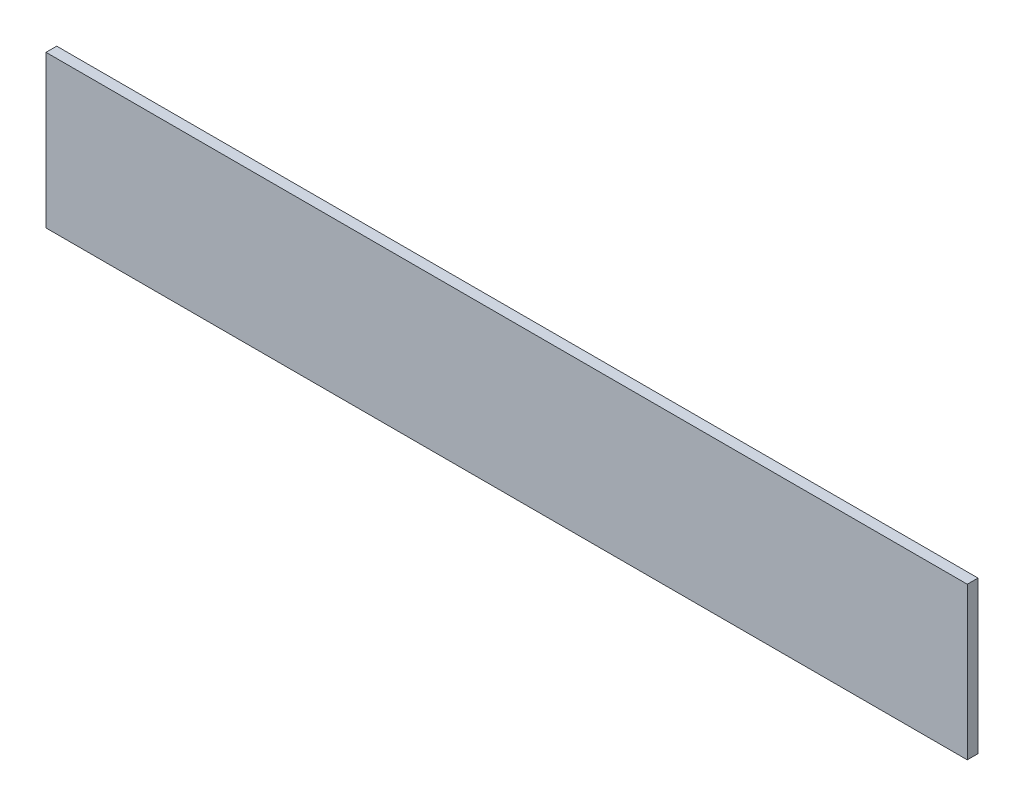
ISO-10303-21;
HEADER;
FILE_DESCRIPTION(('STEP AP214'),'2;1');
FILE_NAME('part.step','',(''),(''),'','','');
FILE_SCHEMA(('AUTOMOTIVE_DESIGN { 1 0 10303 214 1 1 1 1 }'));
ENDSEC;
DATA;
#1=APPLICATION_CONTEXT('core data for automotive mechanical design processes');
#2=APPLICATION_PROTOCOL_DEFINITION('international standard','automotive_design',2000,#1);
#3=PRODUCT_CONTEXT('',#1,'mechanical');
#4=PRODUCT('Part','Part','',(#3));
#5=PRODUCT_RELATED_PRODUCT_CATEGORY('part','',(#4));
#6=PRODUCT_DEFINITION_FORMATION('','',#4);
#7=PRODUCT_DEFINITION_CONTEXT('part definition',#1,'design');
#8=PRODUCT_DEFINITION('design','',#6,#7);
#9=PRODUCT_DEFINITION_SHAPE('','',#8);
#10=(LENGTH_UNIT() NAMED_UNIT(*) SI_UNIT(.MILLI.,.METRE.));
#11=(NAMED_UNIT(*) PLANE_ANGLE_UNIT() SI_UNIT($,.RADIAN.));
#12=(NAMED_UNIT(*) SI_UNIT($,.STERADIAN.) SOLID_ANGLE_UNIT());
#13=UNCERTAINTY_MEASURE_WITH_UNIT(LENGTH_MEASURE(1.E-05),#10,'distance_accuracy_value','');
#14=(GEOMETRIC_REPRESENTATION_CONTEXT(3) GLOBAL_UNCERTAINTY_ASSIGNED_CONTEXT((#13)) GLOBAL_UNIT_ASSIGNED_CONTEXT((#10,
#11,#12)) REPRESENTATION_CONTEXT('',''));
#15=CARTESIAN_POINT('',(0.,0.,0.));
#16=DIRECTION('',(0.,0.,1.));
#17=DIRECTION('',(1.,0.,0.));
#18=AXIS2_PLACEMENT_3D('',#15,#16,#17);
#19=CARTESIAN_POINT('',(-74.1175142331236,-24.349358974359,5.));
#20=DIRECTION('',(1.,0.,0.));
#21=DIRECTION('',(0.,0.,-1.));
#22=AXIS2_PLACEMENT_3D('',#19,#20,#21);
#23=PLANE('',#22);
#24=DIRECTION('',(0.,-1.,0.));
#25=VECTOR('',#24,1.);
#26=CARTESIAN_POINT('',(-74.1175142331236,-24.349358974359,0.));
#27=LINE('',#26,#25);
#28=CARTESIAN_POINT('',(-74.1175142331236,46.650641025641,0.));
#29=VERTEX_POINT('',#28);
#30=CARTESIAN_POINT('',(-74.1175142331236,-24.349358974359,0.));
#31=VERTEX_POINT('',#30);
#32=EDGE_CURVE('E93',#29,#31,#27,.T.);
#33=ORIENTED_EDGE('',*,*,#32,.T.);
#34=DIRECTION('',(0.,0.,-1.));
#35=VECTOR('',#34,1.);
#36=CARTESIAN_POINT('',(-74.1175142331236,-24.349358974359,5.));
#37=LINE('',#36,#35);
#38=CARTESIAN_POINT('',(-74.1175142331236,-24.349358974359,5.));
#39=VERTEX_POINT('',#38);
#40=EDGE_CURVE('E11',#39,#31,#37,.T.);
#41=ORIENTED_EDGE('',*,*,#40,.F.);
#42=DIRECTION('',(0.,-1.,0.));
#43=VECTOR('',#42,1.);
#44=CARTESIAN_POINT('',(-74.1175142331236,-24.349358974359,5.));
#45=LINE('',#44,#43);
#46=CARTESIAN_POINT('',(-74.1175142331236,46.650641025641,5.));
#47=VERTEX_POINT('',#46);
#48=EDGE_CURVE('E81',#47,#39,#45,.T.);
#49=ORIENTED_EDGE('',*,*,#48,.F.);
#50=DIRECTION('',(0.,0.,-1.));
#51=VECTOR('',#50,1.);
#52=CARTESIAN_POINT('',(-74.1175142331236,46.650641025641,5.));
#53=LINE('',#52,#51);
#54=EDGE_CURVE('E89',#47,#29,#53,.T.);
#55=ORIENTED_EDGE('',*,*,#54,.T.);
#56=EDGE_LOOP('',(#33,#41,#49,#55));
#57=FACE_BOUND('',#56,.T.);
#58=ADVANCED_FACE('F30',(#57),#23,.F.);
#59=CARTESIAN_POINT('',(-74.1175142331236,-24.349358974359,5.));
#60=DIRECTION('',(0.,1.,0.));
#61=DIRECTION('',(0.,0.,1.));
#62=AXIS2_PLACEMENT_3D('',#59,#60,#61);
#63=PLANE('',#62);
#64=DIRECTION('',(1.,0.,0.));
#65=VECTOR('',#64,1.);
#66=CARTESIAN_POINT('',(-74.1175142331236,-24.349358974359,0.));
#67=LINE('',#66,#65);
#68=CARTESIAN_POINT('',(355.882485766876,-24.349358974359,0.));
#69=VERTEX_POINT('',#68);
#70=EDGE_CURVE('E85',#31,#69,#67,.T.);
#71=ORIENTED_EDGE('',*,*,#70,.T.);
#72=DIRECTION('',(0.,0.,-1.));
#73=VECTOR('',#72,1.);
#74=CARTESIAN_POINT('',(355.882485766876,-24.349358974359,5.));
#75=LINE('',#74,#73);
#76=CARTESIAN_POINT('',(355.882485766876,-24.349358974359,5.));
#77=VERTEX_POINT('',#76);
#78=EDGE_CURVE('E38',#77,#69,#75,.T.);
#79=ORIENTED_EDGE('',*,*,#78,.F.);
#80=DIRECTION('',(1.,0.,0.));
#81=VECTOR('',#80,1.);
#82=CARTESIAN_POINT('',(-74.1175142331236,-24.349358974359,5.));
#83=LINE('',#82,#81);
#84=EDGE_CURVE('E76',#39,#77,#83,.T.);
#85=ORIENTED_EDGE('',*,*,#84,.F.);
#86=ORIENTED_EDGE('',*,*,#40,.T.);
#87=EDGE_LOOP('',(#71,#79,#85,#86));
#88=FACE_BOUND('',#87,.T.);
#89=ADVANCED_FACE('F84',(#88),#63,.F.);
#90=CARTESIAN_POINT('',(355.882485766876,-24.349358974359,5.));
#91=DIRECTION('',(-1.,0.,0.));
#92=DIRECTION('',(0.,0.,1.));
#93=AXIS2_PLACEMENT_3D('',#90,#91,#92);
#94=PLANE('',#93);
#95=DIRECTION('',(0.,1.,0.));
#96=VECTOR('',#95,1.);
#97=CARTESIAN_POINT('',(355.882485766876,-24.349358974359,0.));
#98=LINE('',#97,#96);
#99=CARTESIAN_POINT('',(355.882485766876,46.650641025641,0.));
#100=VERTEX_POINT('',#99);
#101=EDGE_CURVE('E63',#69,#100,#98,.T.);
#102=ORIENTED_EDGE('',*,*,#101,.T.);
#103=DIRECTION('',(0.,0.,-1.));
#104=VECTOR('',#103,1.);
#105=CARTESIAN_POINT('',(355.882485766876,46.650641025641,5.));
#106=LINE('',#105,#104);
#107=CARTESIAN_POINT('',(355.882485766876,46.650641025641,5.));
#108=VERTEX_POINT('',#107);
#109=EDGE_CURVE('E86',#108,#100,#106,.T.);
#110=ORIENTED_EDGE('',*,*,#109,.F.);
#111=DIRECTION('',(0.,1.,0.));
#112=VECTOR('',#111,1.);
#113=CARTESIAN_POINT('',(355.882485766876,-24.349358974359,5.));
#114=LINE('',#113,#112);
#115=EDGE_CURVE('E79',#77,#108,#114,.T.);
#116=ORIENTED_EDGE('',*,*,#115,.F.);
#117=ORIENTED_EDGE('',*,*,#78,.T.);
#118=EDGE_LOOP('',(#102,#110,#116,#117));
#119=FACE_BOUND('',#118,.T.);
#120=ADVANCED_FACE('F87',(#119),#94,.F.);
#121=CARTESIAN_POINT('',(-74.1175142331236,46.650641025641,5.));
#122=DIRECTION('',(0.,-1.,0.));
#123=DIRECTION('',(0.,0.,-1.));
#124=AXIS2_PLACEMENT_3D('',#121,#122,#123);
#125=PLANE('',#124);
#126=DIRECTION('',(-1.,0.,0.));
#127=VECTOR('',#126,1.);
#128=CARTESIAN_POINT('',(-74.1175142331236,46.650641025641,0.));
#129=LINE('',#128,#127);
#130=EDGE_CURVE('E69',#100,#29,#129,.T.);
#131=ORIENTED_EDGE('',*,*,#130,.T.);
#132=ORIENTED_EDGE('',*,*,#54,.F.);
#133=DIRECTION('',(-1.,0.,0.));
#134=VECTOR('',#133,1.);
#135=CARTESIAN_POINT('',(-74.1175142331236,46.650641025641,5.));
#136=LINE('',#135,#134);
#137=EDGE_CURVE('E46',#108,#47,#136,.T.);
#138=ORIENTED_EDGE('',*,*,#137,.F.);
#139=ORIENTED_EDGE('',*,*,#109,.T.);
#140=EDGE_LOOP('',(#131,#132,#138,#139));
#141=FACE_BOUND('',#140,.T.);
#142=ADVANCED_FACE('F100',(#141),#125,.F.);
#143=CARTESIAN_POINT('',(0.,0.,5.));
#144=DIRECTION('',(0.,0.,-1.));
#145=DIRECTION('',(-1.,0.,0.));
#146=AXIS2_PLACEMENT_3D('',#143,#144,#145);
#147=PLANE('',#146);
#148=ORIENTED_EDGE('',*,*,#48,.T.);
#149=ORIENTED_EDGE('',*,*,#84,.T.);
#150=ORIENTED_EDGE('',*,*,#115,.T.);
#151=ORIENTED_EDGE('',*,*,#137,.T.);
#152=EDGE_LOOP('',(#148,#149,#150,#151));
#153=FACE_BOUND('',#152,.T.);
#154=ADVANCED_FACE('F77',(#153),#147,.F.);
#155=CARTESIAN_POINT('',(0.,0.,0.));
#156=DIRECTION('',(0.,0.,-1.));
#157=DIRECTION('',(-1.,0.,0.));
#158=AXIS2_PLACEMENT_3D('',#155,#156,#157);
#159=PLANE('',#158);
#160=ORIENTED_EDGE('',*,*,#32,.F.);
#161=ORIENTED_EDGE('',*,*,#130,.F.);
#162=ORIENTED_EDGE('',*,*,#101,.F.);
#163=ORIENTED_EDGE('',*,*,#70,.F.);
#164=EDGE_LOOP('',(#160,#161,#162,#163));
#165=FACE_BOUND('',#164,.T.);
#166=ADVANCED_FACE('F103',(#165),#159,.T.);
#167=CLOSED_SHELL('',(#58,#89,#120,#142,#154,#166));
#168=MANIFOLD_SOLID_BREP('B2',#167);
#169=ADVANCED_BREP_SHAPE_REPRESENTATION('',(#18,#168),#14);
#170=SHAPE_DEFINITION_REPRESENTATION(#9,#169);
ENDSEC;
END-ISO-10303-21;
